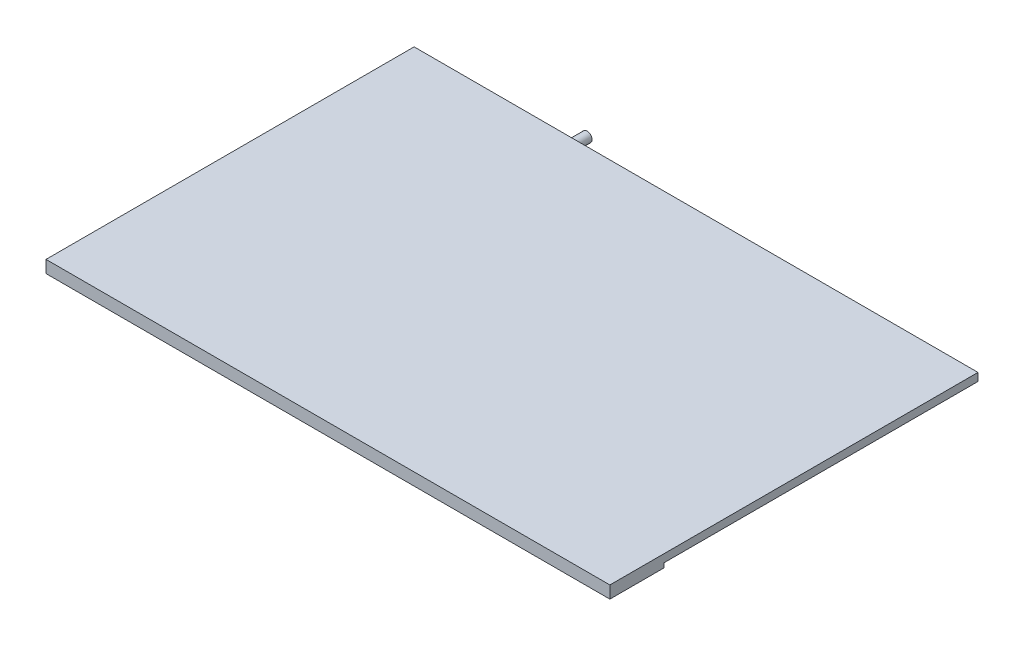
ISO-10303-21;
HEADER;
FILE_DESCRIPTION(('STEP AP214'),'2;1');
FILE_NAME('part.step','',(''),(''),'','','');
FILE_SCHEMA(('AUTOMOTIVE_DESIGN { 1 0 10303 214 1 1 1 1 }'));
ENDSEC;
DATA;
#1=APPLICATION_CONTEXT('core data for automotive mechanical design processes');
#2=APPLICATION_PROTOCOL_DEFINITION('international standard','automotive_design',2000,#1);
#3=PRODUCT_CONTEXT('',#1,'mechanical');
#4=PRODUCT('Part','Part','',(#3));
#5=PRODUCT_RELATED_PRODUCT_CATEGORY('part','',(#4));
#6=PRODUCT_DEFINITION_FORMATION('','',#4);
#7=PRODUCT_DEFINITION_CONTEXT('part definition',#1,'design');
#8=PRODUCT_DEFINITION('design','',#6,#7);
#9=PRODUCT_DEFINITION_SHAPE('','',#8);
#10=(LENGTH_UNIT() NAMED_UNIT(*) SI_UNIT(.MILLI.,.METRE.));
#11=(NAMED_UNIT(*) PLANE_ANGLE_UNIT() SI_UNIT($,.RADIAN.));
#12=(NAMED_UNIT(*) SI_UNIT($,.STERADIAN.) SOLID_ANGLE_UNIT());
#13=UNCERTAINTY_MEASURE_WITH_UNIT(LENGTH_MEASURE(1.E-05),#10,'distance_accuracy_value','');
#14=(GEOMETRIC_REPRESENTATION_CONTEXT(3) GLOBAL_UNCERTAINTY_ASSIGNED_CONTEXT((#13)) GLOBAL_UNIT_ASSIGNED_CONTEXT((#10,
#11,#12)) REPRESENTATION_CONTEXT('',''));
#15=CARTESIAN_POINT('',(0.,0.,0.));
#16=DIRECTION('',(0.,0.,1.));
#17=DIRECTION('',(1.,0.,0.));
#18=AXIS2_PLACEMENT_3D('',#15,#16,#17);
#19=CARTESIAN_POINT('',(0.,-4.8,-74.75));
#20=DIRECTION('',(0.,0.,-1.));
#21=DIRECTION('',(-1.,0.,0.));
#22=AXIS2_PLACEMENT_3D('',#19,#20,#21);
#23=PLANE('',#22);
#24=CARTESIAN_POINT('',(-54.25,-3.3,-74.75));
#25=DIRECTION('',(0.,0.,-1.));
#26=DIRECTION('',(-1.,0.,0.));
#27=AXIS2_PLACEMENT_3D('',#24,#25,#26);
#28=CIRCLE('',#27,2.);
#29=CARTESIAN_POINT('',(-52.9271243444677,-1.8,-74.75));
#30=VERTEX_POINT('',#29);
#31=CARTESIAN_POINT('',(-52.9271243444677,-4.8,-74.75));
#32=VERTEX_POINT('',#31);
#33=EDGE_CURVE('E11',#30,#32,#28,.T.);
#34=ORIENTED_EDGE('',*,*,#33,.F.);
#35=DIRECTION('',(-1.,0.,0.));
#36=VECTOR('',#35,1.);
#37=CARTESIAN_POINT('',(0.,-1.8,-74.75));
#38=LINE('',#37,#36);
#39=CARTESIAN_POINT('',(-48.75,-1.8,-74.75));
#40=VERTEX_POINT('',#39);
#41=EDGE_CURVE('E170',#40,#30,#38,.T.);
#42=ORIENTED_EDGE('',*,*,#41,.F.);
#43=DIRECTION('',(0.,1.,0.));
#44=VECTOR('',#43,1.);
#45=CARTESIAN_POINT('',(-48.75,-4.8,-74.75));
#46=LINE('',#45,#44);
#47=CARTESIAN_POINT('',(-48.75,-4.8,-74.75));
#48=VERTEX_POINT('',#47);
#49=EDGE_CURVE('E232',#48,#40,#46,.T.);
#50=ORIENTED_EDGE('',*,*,#49,.F.);
#51=DIRECTION('',(-1.,0.,0.));
#52=VECTOR('',#51,1.);
#53=CARTESIAN_POINT('',(0.,-4.8,-74.75));
#54=LINE('',#53,#52);
#55=EDGE_CURVE('E207',#48,#32,#54,.T.);
#56=ORIENTED_EDGE('',*,*,#55,.T.);
#57=EDGE_LOOP('',(#34,#42,#50,#56));
#58=FACE_BOUND('',#57,.T.);
#59=ADVANCED_FACE('F40',(#58),#23,.T.);
#60=CARTESIAN_POINT('',(0.,0.,0.));
#61=DIRECTION('',(0.,1.,0.));
#62=DIRECTION('',(0.,0.,1.));
#63=AXIS2_PLACEMENT_3D('',#60,#61,#62);
#64=PLANE('',#63);
#65=DIRECTION('',(1.,0.,0.));
#66=VECTOR('',#65,1.);
#67=CARTESIAN_POINT('',(0.,0.,52.75));
#68=LINE('',#67,#66);
#69=CARTESIAN_POINT('',(-114.5,0.,52.75));
#70=VERTEX_POINT('',#69);
#71=CARTESIAN_POINT('',(114.5,0.,52.75));
#72=VERTEX_POINT('',#71);
#73=EDGE_CURVE('E44',#70,#72,#68,.T.);
#74=ORIENTED_EDGE('',*,*,#73,.F.);
#75=DIRECTION('',(0.,0.,1.));
#76=VECTOR('',#75,1.);
#77=CARTESIAN_POINT('',(-114.5,0.,-74.75));
#78=LINE('',#77,#76);
#79=CARTESIAN_POINT('',(-114.5,0.,-74.75));
#80=VERTEX_POINT('',#79);
#81=EDGE_CURVE('E264',#80,#70,#78,.T.);
#82=ORIENTED_EDGE('',*,*,#81,.F.);
#83=DIRECTION('',(-1.,0.,0.));
#84=VECTOR('',#83,1.);
#85=CARTESIAN_POINT('',(-114.5,0.,-74.75));
#86=LINE('',#85,#84);
#87=CARTESIAN_POINT('',(114.5,0.,-74.75));
#88=VERTEX_POINT('',#87);
#89=EDGE_CURVE('E269',#88,#80,#86,.T.);
#90=ORIENTED_EDGE('',*,*,#89,.F.);
#91=DIRECTION('',(0.,0.,-1.));
#92=VECTOR('',#91,1.);
#93=CARTESIAN_POINT('',(114.5,0.,-74.75));
#94=LINE('',#93,#92);
#95=EDGE_CURVE('E278',#72,#88,#94,.T.);
#96=ORIENTED_EDGE('',*,*,#95,.F.);
#97=EDGE_LOOP('',(#74,#82,#90,#96));
#98=FACE_BOUND('',#97,.T.);
#99=ADVANCED_FACE('F306',(#98),#64,.F.);
#100=CARTESIAN_POINT('',(-114.5,3.2,-74.75));
#101=DIRECTION('',(1.,0.,0.));
#102=DIRECTION('',(0.,0.,-1.));
#103=AXIS2_PLACEMENT_3D('',#100,#101,#102);
#104=PLANE('',#103);
#105=DIRECTION('',(0.,-1.,0.));
#106=VECTOR('',#105,1.);
#107=CARTESIAN_POINT('',(-114.5,3.2,74.75));
#108=LINE('',#107,#106);
#109=CARTESIAN_POINT('',(-114.5,3.2,74.75));
#110=VERTEX_POINT('',#109);
#111=CARTESIAN_POINT('',(-114.5,-1.8,74.75));
#112=VERTEX_POINT('',#111);
#113=EDGE_CURVE('E287',#110,#112,#108,.T.);
#114=ORIENTED_EDGE('',*,*,#113,.F.);
#115=DIRECTION('',(0.,0.,1.));
#116=VECTOR('',#115,1.);
#117=CARTESIAN_POINT('',(-114.5,3.2,-74.75));
#118=LINE('',#117,#116);
#119=CARTESIAN_POINT('',(-114.5,3.2,-74.75));
#120=VERTEX_POINT('',#119);
#121=EDGE_CURVE('E266',#120,#110,#118,.T.);
#122=ORIENTED_EDGE('',*,*,#121,.F.);
#123=DIRECTION('',(0.,-1.,0.));
#124=VECTOR('',#123,1.);
#125=CARTESIAN_POINT('',(-114.5,3.2,-74.75));
#126=LINE('',#125,#124);
#127=EDGE_CURVE('E275',#120,#80,#126,.T.);
#128=ORIENTED_EDGE('',*,*,#127,.T.);
#129=ORIENTED_EDGE('',*,*,#81,.T.);
#130=DIRECTION('',(0.,1.,0.));
#131=VECTOR('',#130,1.);
#132=CARTESIAN_POINT('',(-114.5,-1.8,52.75));
#133=LINE('',#132,#131);
#134=CARTESIAN_POINT('',(-114.5,-1.8,52.75));
#135=VERTEX_POINT('',#134);
#136=EDGE_CURVE('E260',#135,#70,#133,.T.);
#137=ORIENTED_EDGE('',*,*,#136,.F.);
#138=DIRECTION('',(0.,0.,1.));
#139=VECTOR('',#138,1.);
#140=CARTESIAN_POINT('',(-114.5,-1.8,0.));
#141=LINE('',#140,#139);
#142=EDGE_CURVE('E250',#135,#112,#141,.T.);
#143=ORIENTED_EDGE('',*,*,#142,.T.);
#144=EDGE_LOOP('',(#114,#122,#128,#129,#137,#143));
#145=FACE_BOUND('',#144,.T.);
#146=ADVANCED_FACE('F42',(#145),#104,.F.);
#147=CARTESIAN_POINT('',(-114.5,3.2,74.75));
#148=DIRECTION('',(0.,0.,-1.));
#149=DIRECTION('',(-1.,0.,0.));
#150=AXIS2_PLACEMENT_3D('',#147,#148,#149);
#151=PLANE('',#150);
#152=ORIENTED_EDGE('',*,*,#113,.T.);
#153=DIRECTION('',(1.,0.,0.));
#154=VECTOR('',#153,1.);
#155=CARTESIAN_POINT('',(0.,-1.8,74.75));
#156=LINE('',#155,#154);
#157=CARTESIAN_POINT('',(114.5,-1.8,74.75));
#158=VERTEX_POINT('',#157);
#159=EDGE_CURVE('E254',#112,#158,#156,.T.);
#160=ORIENTED_EDGE('',*,*,#159,.T.);
#161=DIRECTION('',(0.,-1.,0.));
#162=VECTOR('',#161,1.);
#163=CARTESIAN_POINT('',(114.5,3.2,74.75));
#164=LINE('',#163,#162);
#165=CARTESIAN_POINT('',(114.5,3.2,74.75));
#166=VERTEX_POINT('',#165);
#167=EDGE_CURVE('E286',#166,#158,#164,.T.);
#168=ORIENTED_EDGE('',*,*,#167,.F.);
#169=DIRECTION('',(1.,0.,0.));
#170=VECTOR('',#169,1.);
#171=CARTESIAN_POINT('',(-114.5,3.2,74.75));
#172=LINE('',#171,#170);
#173=EDGE_CURVE('E268',#110,#166,#172,.T.);
#174=ORIENTED_EDGE('',*,*,#173,.F.);
#175=EDGE_LOOP('',(#152,#160,#168,#174));
#176=FACE_BOUND('',#175,.T.);
#177=ADVANCED_FACE('F316',(#176),#151,.F.);
#178=CARTESIAN_POINT('',(114.5,3.2,-74.75));
#179=DIRECTION('',(-1.,0.,0.));
#180=DIRECTION('',(0.,0.,1.));
#181=AXIS2_PLACEMENT_3D('',#178,#179,#180);
#182=PLANE('',#181);
#183=ORIENTED_EDGE('',*,*,#167,.T.);
#184=DIRECTION('',(0.,0.,-1.));
#185=VECTOR('',#184,1.);
#186=CARTESIAN_POINT('',(114.5,-1.8,0.));
#187=LINE('',#186,#185);
#188=CARTESIAN_POINT('',(114.5,-1.8,52.75));
#189=VERTEX_POINT('',#188);
#190=EDGE_CURVE('E257',#158,#189,#187,.T.);
#191=ORIENTED_EDGE('',*,*,#190,.T.);
#192=DIRECTION('',(0.,1.,0.));
#193=VECTOR('',#192,1.);
#194=CARTESIAN_POINT('',(114.5,-1.8,52.75));
#195=LINE('',#194,#193);
#196=EDGE_CURVE('E261',#189,#72,#195,.T.);
#197=ORIENTED_EDGE('',*,*,#196,.T.);
#198=ORIENTED_EDGE('',*,*,#95,.T.);
#199=DIRECTION('',(0.,-1.,0.));
#200=VECTOR('',#199,1.);
#201=CARTESIAN_POINT('',(114.5,3.2,-74.75));
#202=LINE('',#201,#200);
#203=CARTESIAN_POINT('',(114.5,3.2,-74.75));
#204=VERTEX_POINT('',#203);
#205=EDGE_CURVE('E283',#204,#88,#202,.T.);
#206=ORIENTED_EDGE('',*,*,#205,.F.);
#207=DIRECTION('',(0.,0.,-1.));
#208=VECTOR('',#207,1.);
#209=CARTESIAN_POINT('',(114.5,3.2,-74.75));
#210=LINE('',#209,#208);
#211=EDGE_CURVE('E271',#166,#204,#210,.T.);
#212=ORIENTED_EDGE('',*,*,#211,.F.);
#213=EDGE_LOOP('',(#183,#191,#197,#198,#206,#212));
#214=FACE_BOUND('',#213,.T.);
#215=ADVANCED_FACE('F302',(#214),#182,.F.);
#216=CARTESIAN_POINT('',(-114.5,3.2,-74.75));
#217=DIRECTION('',(0.,0.,1.));
#218=DIRECTION('',(1.,0.,0.));
#219=AXIS2_PLACEMENT_3D('',#216,#217,#218);
#220=PLANE('',#219);
#221=ORIENTED_EDGE('',*,*,#89,.T.);
#222=ORIENTED_EDGE('',*,*,#127,.F.);
#223=DIRECTION('',(-1.,0.,0.));
#224=VECTOR('',#223,1.);
#225=CARTESIAN_POINT('',(-114.5,3.2,-74.75));
#226=LINE('',#225,#224);
#227=EDGE_CURVE('E273',#204,#120,#226,.T.);
#228=ORIENTED_EDGE('',*,*,#227,.F.);
#229=ORIENTED_EDGE('',*,*,#205,.T.);
#230=EDGE_LOOP('',(#221,#222,#228,#229));
#231=FACE_BOUND('',#230,.T.);
#232=ADVANCED_FACE('F309',(#231),#220,.F.);
#233=CARTESIAN_POINT('',(0.,3.2,0.));
#234=DIRECTION('',(0.,1.,0.));
#235=DIRECTION('',(0.,0.,1.));
#236=AXIS2_PLACEMENT_3D('',#233,#234,#235);
#237=PLANE('',#236);
#238=ORIENTED_EDGE('',*,*,#211,.T.);
#239=ORIENTED_EDGE('',*,*,#227,.T.);
#240=ORIENTED_EDGE('',*,*,#121,.T.);
#241=ORIENTED_EDGE('',*,*,#173,.T.);
#242=EDGE_LOOP('',(#238,#239,#240,#241));
#243=FACE_BOUND('',#242,.T.);
#244=ADVANCED_FACE('F314',(#243),#237,.T.);
#245=CARTESIAN_POINT('',(0.,-1.8,52.75));
#246=DIRECTION('',(0.,0.,1.));
#247=DIRECTION('',(1.,0.,0.));
#248=AXIS2_PLACEMENT_3D('',#245,#246,#247);
#249=PLANE('',#248);
#250=ORIENTED_EDGE('',*,*,#136,.T.);
#251=ORIENTED_EDGE('',*,*,#73,.T.);
#252=ORIENTED_EDGE('',*,*,#196,.F.);
#253=DIRECTION('',(1.,0.,0.));
#254=VECTOR('',#253,1.);
#255=CARTESIAN_POINT('',(0.,-1.8,52.75));
#256=LINE('',#255,#254);
#257=CARTESIAN_POINT('',(-41.,-1.8,52.75));
#258=VERTEX_POINT('',#257);
#259=EDGE_CURVE('E246',#258,#189,#256,.T.);
#260=ORIENTED_EDGE('',*,*,#259,.F.);
#261=CARTESIAN_POINT('',(-67.5,-1.8,52.75));
#262=VERTEX_POINT('',#261);
#263=EDGE_CURVE('E251',#262,#258,#256,.T.);
#264=ORIENTED_EDGE('',*,*,#263,.F.);
#265=EDGE_CURVE('E247',#135,#262,#256,.T.);
#266=ORIENTED_EDGE('',*,*,#265,.F.);
#267=EDGE_LOOP('',(#250,#251,#252,#260,#264,#266));
#268=FACE_BOUND('',#267,.T.);
#269=ADVANCED_FACE('F295',(#268),#249,.F.);
#270=CARTESIAN_POINT('',(0.,-1.8,0.));
#271=DIRECTION('',(0.,1.,0.));
#272=DIRECTION('',(0.,0.,1.));
#273=AXIS2_PLACEMENT_3D('',#270,#271,#272);
#274=PLANE('',#273);
#275=DIRECTION('',(1.,0.,0.));
#276=VECTOR('',#275,1.);
#277=CARTESIAN_POINT('',(0.,-1.8,61.55));
#278=LINE('',#277,#276);
#279=CARTESIAN_POINT('',(-67.5,-1.8,61.55));
#280=VERTEX_POINT('',#279);
#281=CARTESIAN_POINT('',(-41.,-1.8,61.55));
#282=VERTEX_POINT('',#281);
#283=EDGE_CURVE('E215',#280,#282,#278,.T.);
#284=ORIENTED_EDGE('',*,*,#283,.T.);
#285=DIRECTION('',(0.,0.,-1.));
#286=VECTOR('',#285,1.);
#287=CARTESIAN_POINT('',(-41.,-1.8,0.));
#288=LINE('',#287,#286);
#289=EDGE_CURVE('E212',#282,#258,#288,.T.);
#290=ORIENTED_EDGE('',*,*,#289,.T.);
#291=ORIENTED_EDGE('',*,*,#259,.T.);
#292=ORIENTED_EDGE('',*,*,#190,.F.);
#293=ORIENTED_EDGE('',*,*,#159,.F.);
#294=ORIENTED_EDGE('',*,*,#142,.F.);
#295=ORIENTED_EDGE('',*,*,#265,.T.);
#296=DIRECTION('',(0.,0.,-1.));
#297=VECTOR('',#296,1.);
#298=CARTESIAN_POINT('',(-67.5,-1.8,0.));
#299=LINE('',#298,#297);
#300=EDGE_CURVE('E219',#280,#262,#299,.T.);
#301=ORIENTED_EDGE('',*,*,#300,.F.);
#302=EDGE_LOOP('',(#284,#290,#291,#292,#293,#294,#295,#301));
#303=FACE_BOUND('',#302,.T.);
#304=ADVANCED_FACE('F320',(#303),#274,.F.);
#305=CARTESIAN_POINT('',(0.,-1.8,0.));
#306=DIRECTION('',(0.,-1.,0.));
#307=DIRECTION('',(0.,0.,-1.));
#308=AXIS2_PLACEMENT_3D('',#305,#306,#307);
#309=PLANE('',#308);
#310=CARTESIAN_POINT('',(-67.5,-1.8,39.55));
#311=VERTEX_POINT('',#310);
#312=EDGE_CURVE('E218',#262,#311,#299,.T.);
#313=ORIENTED_EDGE('',*,*,#312,.F.);
#314=ORIENTED_EDGE('',*,*,#263,.T.);
#315=CARTESIAN_POINT('',(-41.,-1.8,39.55));
#316=VERTEX_POINT('',#315);
#317=EDGE_CURVE('E188',#258,#316,#288,.T.);
#318=ORIENTED_EDGE('',*,*,#317,.T.);
#319=DIRECTION('',(1.,0.,0.));
#320=VECTOR('',#319,1.);
#321=CARTESIAN_POINT('',(0.,-1.8,39.55));
#322=LINE('',#321,#320);
#323=CARTESIAN_POINT('',(-48.75,-1.8,39.55));
#324=VERTEX_POINT('',#323);
#325=EDGE_CURVE('E195',#324,#316,#322,.T.);
#326=ORIENTED_EDGE('',*,*,#325,.F.);
#327=DIRECTION('',(0.,0.,-1.));
#328=VECTOR('',#327,1.);
#329=CARTESIAN_POINT('',(-48.75,-1.8,0.));
#330=LINE('',#329,#328);
#331=EDGE_CURVE('E225',#324,#40,#330,.T.);
#332=ORIENTED_EDGE('',*,*,#331,.T.);
#333=ORIENTED_EDGE('',*,*,#41,.T.);
#334=CARTESIAN_POINT('',(-55.5728756555323,-1.8,-74.75));
#335=VERTEX_POINT('',#334);
#336=EDGE_CURVE('E163',#30,#335,#38,.T.);
#337=ORIENTED_EDGE('',*,*,#336,.T.);
#338=CARTESIAN_POINT('',(-59.75,-1.8,-74.75));
#339=VERTEX_POINT('',#338);
#340=EDGE_CURVE('E166',#335,#339,#38,.T.);
#341=ORIENTED_EDGE('',*,*,#340,.T.);
#342=DIRECTION('',(0.,0.,-1.));
#343=VECTOR('',#342,1.);
#344=CARTESIAN_POINT('',(-59.75,-1.8,0.));
#345=LINE('',#344,#343);
#346=CARTESIAN_POINT('',(-59.75,-1.8,39.55));
#347=VERTEX_POINT('',#346);
#348=EDGE_CURVE('E179',#347,#339,#345,.T.);
#349=ORIENTED_EDGE('',*,*,#348,.F.);
#350=EDGE_CURVE('E222',#311,#347,#322,.T.);
#351=ORIENTED_EDGE('',*,*,#350,.F.);
#352=EDGE_LOOP('',(#313,#314,#318,#326,#332,#333,#337,#341,#349,#351));
#353=FACE_BOUND('',#352,.T.);
#354=ADVANCED_FACE('F164',(#353),#309,.F.);
#355=CARTESIAN_POINT('',(-41.,-4.8,0.));
#356=DIRECTION('',(1.,0.,0.));
#357=DIRECTION('',(0.,0.,-1.));
#358=AXIS2_PLACEMENT_3D('',#355,#356,#357);
#359=PLANE('',#358);
#360=ORIENTED_EDGE('',*,*,#289,.F.);
#361=DIRECTION('',(0.,1.,0.));
#362=VECTOR('',#361,1.);
#363=CARTESIAN_POINT('',(-41.,-4.8,61.55));
#364=LINE('',#363,#362);
#365=CARTESIAN_POINT('',(-41.,-4.8,61.55));
#366=VERTEX_POINT('',#365);
#367=EDGE_CURVE('E243',#366,#282,#364,.T.);
#368=ORIENTED_EDGE('',*,*,#367,.F.);
#369=DIRECTION('',(0.,0.,-1.));
#370=VECTOR('',#369,1.);
#371=CARTESIAN_POINT('',(-41.,-4.8,0.));
#372=LINE('',#371,#370);
#373=CARTESIAN_POINT('',(-41.,-4.8,39.55));
#374=VERTEX_POINT('',#373);
#375=EDGE_CURVE('E191',#366,#374,#372,.T.);
#376=ORIENTED_EDGE('',*,*,#375,.T.);
#377=DIRECTION('',(0.,1.,0.));
#378=VECTOR('',#377,1.);
#379=CARTESIAN_POINT('',(-41.,-4.8,39.55));
#380=LINE('',#379,#378);
#381=EDGE_CURVE('E227',#374,#316,#380,.T.);
#382=ORIENTED_EDGE('',*,*,#381,.T.);
#383=ORIENTED_EDGE('',*,*,#317,.F.);
#384=EDGE_LOOP('',(#360,#368,#376,#382,#383));
#385=FACE_BOUND('',#384,.T.);
#386=ADVANCED_FACE('F326',(#385),#359,.T.);
#387=CARTESIAN_POINT('',(0.,-4.8,61.55));
#388=DIRECTION('',(0.,0.,1.));
#389=DIRECTION('',(1.,0.,0.));
#390=AXIS2_PLACEMENT_3D('',#387,#388,#389);
#391=PLANE('',#390);
#392=ORIENTED_EDGE('',*,*,#283,.F.);
#393=DIRECTION('',(0.,1.,0.));
#394=VECTOR('',#393,1.);
#395=CARTESIAN_POINT('',(-67.5,-4.8,61.55));
#396=LINE('',#395,#394);
#397=CARTESIAN_POINT('',(-67.5,-4.8,61.55));
#398=VERTEX_POINT('',#397);
#399=EDGE_CURVE('E241',#398,#280,#396,.T.);
#400=ORIENTED_EDGE('',*,*,#399,.F.);
#401=DIRECTION('',(1.,0.,0.));
#402=VECTOR('',#401,1.);
#403=CARTESIAN_POINT('',(0.,-4.8,61.55));
#404=LINE('',#403,#402);
#405=EDGE_CURVE('E194',#398,#366,#404,.T.);
#406=ORIENTED_EDGE('',*,*,#405,.T.);
#407=ORIENTED_EDGE('',*,*,#367,.T.);
#408=EDGE_LOOP('',(#392,#400,#406,#407));
#409=FACE_BOUND('',#408,.T.);
#410=ADVANCED_FACE('F356',(#409),#391,.T.);
#411=CARTESIAN_POINT('',(-67.5,-4.8,0.));
#412=DIRECTION('',(1.,0.,0.));
#413=DIRECTION('',(0.,0.,-1.));
#414=AXIS2_PLACEMENT_3D('',#411,#412,#413);
#415=PLANE('',#414);
#416=ORIENTED_EDGE('',*,*,#300,.T.);
#417=ORIENTED_EDGE('',*,*,#312,.T.);
#418=DIRECTION('',(0.,1.,0.));
#419=VECTOR('',#418,1.);
#420=CARTESIAN_POINT('',(-67.5,-4.8,39.55));
#421=LINE('',#420,#419);
#422=CARTESIAN_POINT('',(-67.5,-4.8,39.55));
#423=VERTEX_POINT('',#422);
#424=EDGE_CURVE('E238',#423,#311,#421,.T.);
#425=ORIENTED_EDGE('',*,*,#424,.F.);
#426=DIRECTION('',(0.,0.,-1.));
#427=VECTOR('',#426,1.);
#428=CARTESIAN_POINT('',(-67.5,-4.8,0.));
#429=LINE('',#428,#427);
#430=EDGE_CURVE('E198',#398,#423,#429,.T.);
#431=ORIENTED_EDGE('',*,*,#430,.F.);
#432=ORIENTED_EDGE('',*,*,#399,.T.);
#433=EDGE_LOOP('',(#416,#417,#425,#431,#432));
#434=FACE_BOUND('',#433,.T.);
#435=ADVANCED_FACE('F351',(#434),#415,.F.);
#436=CARTESIAN_POINT('',(0.,-4.8,39.55));
#437=DIRECTION('',(0.,0.,1.));
#438=DIRECTION('',(1.,0.,0.));
#439=AXIS2_PLACEMENT_3D('',#436,#437,#438);
#440=PLANE('',#439);
#441=ORIENTED_EDGE('',*,*,#350,.T.);
#442=DIRECTION('',(0.,1.,0.));
#443=VECTOR('',#442,1.);
#444=CARTESIAN_POINT('',(-59.75,-4.8,39.55));
#445=LINE('',#444,#443);
#446=CARTESIAN_POINT('',(-59.75,-4.8,39.55));
#447=VERTEX_POINT('',#446);
#448=EDGE_CURVE('E235',#447,#347,#445,.T.);
#449=ORIENTED_EDGE('',*,*,#448,.F.);
#450=DIRECTION('',(1.,0.,0.));
#451=VECTOR('',#450,1.);
#452=CARTESIAN_POINT('',(0.,-4.8,39.55));
#453=LINE('',#452,#451);
#454=EDGE_CURVE('E200',#423,#447,#453,.T.);
#455=ORIENTED_EDGE('',*,*,#454,.F.);
#456=ORIENTED_EDGE('',*,*,#424,.T.);
#457=EDGE_LOOP('',(#441,#449,#455,#456));
#458=FACE_BOUND('',#457,.T.);
#459=ADVANCED_FACE('F347',(#458),#440,.F.);
#460=CARTESIAN_POINT('',(-59.75,-4.8,0.));
#461=DIRECTION('',(1.,0.,0.));
#462=DIRECTION('',(0.,0.,-1.));
#463=AXIS2_PLACEMENT_3D('',#460,#461,#462);
#464=PLANE('',#463);
#465=ORIENTED_EDGE('',*,*,#348,.T.);
#466=DIRECTION('',(0.,1.,0.));
#467=VECTOR('',#466,1.);
#468=CARTESIAN_POINT('',(-59.75,-4.8,-74.75));
#469=LINE('',#468,#467);
#470=CARTESIAN_POINT('',(-59.75,-4.8,-74.75));
#471=VERTEX_POINT('',#470);
#472=EDGE_CURVE('E177',#471,#339,#469,.T.);
#473=ORIENTED_EDGE('',*,*,#472,.F.);
#474=DIRECTION('',(0.,0.,-1.));
#475=VECTOR('',#474,1.);
#476=CARTESIAN_POINT('',(-59.75,-4.8,0.));
#477=LINE('',#476,#475);
#478=EDGE_CURVE('E202',#447,#471,#477,.T.);
#479=ORIENTED_EDGE('',*,*,#478,.F.);
#480=ORIENTED_EDGE('',*,*,#448,.T.);
#481=EDGE_LOOP('',(#465,#473,#479,#480));
#482=FACE_BOUND('',#481,.T.);
#483=ADVANCED_FACE('F345',(#482),#464,.F.);
#484=CARTESIAN_POINT('',(-55.5728756555323,-4.8,-74.75));
#485=VERTEX_POINT('',#484);
#486=EDGE_CURVE('E49',#485,#335,#28,.T.);
#487=ORIENTED_EDGE('',*,*,#486,.F.);
#488=EDGE_CURVE('E206',#485,#471,#54,.T.);
#489=ORIENTED_EDGE('',*,*,#488,.T.);
#490=ORIENTED_EDGE('',*,*,#472,.T.);
#491=ORIENTED_EDGE('',*,*,#340,.F.);
#492=EDGE_LOOP('',(#487,#489,#490,#491));
#493=FACE_BOUND('',#492,.T.);
#494=ADVANCED_FACE('F175',(#493),#23,.T.);
#495=CARTESIAN_POINT('',(-48.75,-4.8,0.));
#496=DIRECTION('',(1.,0.,0.));
#497=DIRECTION('',(0.,0.,-1.));
#498=AXIS2_PLACEMENT_3D('',#495,#496,#497);
#499=PLANE('',#498);
#500=ORIENTED_EDGE('',*,*,#331,.F.);
#501=DIRECTION('',(0.,1.,0.));
#502=VECTOR('',#501,1.);
#503=CARTESIAN_POINT('',(-48.75,-4.8,39.55));
#504=LINE('',#503,#502);
#505=CARTESIAN_POINT('',(-48.75,-4.8,39.55));
#506=VERTEX_POINT('',#505);
#507=EDGE_CURVE('E230',#506,#324,#504,.T.);
#508=ORIENTED_EDGE('',*,*,#507,.F.);
#509=DIRECTION('',(0.,0.,-1.));
#510=VECTOR('',#509,1.);
#511=CARTESIAN_POINT('',(-48.75,-4.8,0.));
#512=LINE('',#511,#510);
#513=EDGE_CURVE('E209',#506,#48,#512,.T.);
#514=ORIENTED_EDGE('',*,*,#513,.T.);
#515=ORIENTED_EDGE('',*,*,#49,.T.);
#516=EDGE_LOOP('',(#500,#508,#514,#515));
#517=FACE_BOUND('',#516,.T.);
#518=ADVANCED_FACE('F335',(#517),#499,.T.);
#519=ORIENTED_EDGE('',*,*,#325,.T.);
#520=ORIENTED_EDGE('',*,*,#381,.F.);
#521=EDGE_CURVE('E203',#506,#374,#453,.T.);
#522=ORIENTED_EDGE('',*,*,#521,.F.);
#523=ORIENTED_EDGE('',*,*,#507,.T.);
#524=EDGE_LOOP('',(#519,#520,#522,#523));
#525=FACE_BOUND('',#524,.T.);
#526=ADVANCED_FACE('F332',(#525),#440,.F.);
#527=CARTESIAN_POINT('',(0.,-4.8,0.));
#528=DIRECTION('',(0.,-1.,0.));
#529=DIRECTION('',(0.,0.,-1.));
#530=AXIS2_PLACEMENT_3D('',#527,#528,#529);
#531=PLANE('',#530);
#532=ORIENTED_EDGE('',*,*,#375,.F.);
#533=ORIENTED_EDGE('',*,*,#405,.F.);
#534=ORIENTED_EDGE('',*,*,#430,.T.);
#535=ORIENTED_EDGE('',*,*,#454,.T.);
#536=ORIENTED_EDGE('',*,*,#478,.T.);
#537=ORIENTED_EDGE('',*,*,#488,.F.);
#538=EDGE_CURVE('E64',#32,#485,#54,.T.);
#539=ORIENTED_EDGE('',*,*,#538,.F.);
#540=ORIENTED_EDGE('',*,*,#55,.F.);
#541=ORIENTED_EDGE('',*,*,#513,.F.);
#542=ORIENTED_EDGE('',*,*,#521,.T.);
#543=EDGE_LOOP('',(#532,#533,#534,#535,#536,#537,#539,#540,#541,#542));
#544=FACE_BOUND('',#543,.T.);
#545=ADVANCED_FACE('F341',(#544),#531,.T.);
#546=CARTESIAN_POINT('',(-54.25,-3.3,-74.75));
#547=DIRECTION('',(0.,0.,-1.));
#548=DIRECTION('',(-1.,0.,0.));
#549=AXIS2_PLACEMENT_3D('',#546,#547,#548);
#550=PLANE('',#549);
#551=EDGE_CURVE('E51',#32,#485,#28,.T.);
#552=ORIENTED_EDGE('',*,*,#551,.F.);
#553=ORIENTED_EDGE('',*,*,#538,.T.);
#554=EDGE_LOOP('',(#552,#553));
#555=FACE_BOUND('',#554,.T.);
#556=ADVANCED_FACE('F339',(#555),#550,.F.);
#557=CARTESIAN_POINT('',(-54.25,-3.3,-84.75));
#558=DIRECTION('',(0.,0.,1.));
#559=DIRECTION('',(1.,0.,0.));
#560=AXIS2_PLACEMENT_3D('',#557,#558,#559);
#561=CYLINDRICAL_SURFACE('',#560,2.);
#562=CARTESIAN_POINT('',(-54.25,-3.3,-84.75));
#563=DIRECTION('',(0.,0.,-1.));
#564=DIRECTION('',(-1.,0.,0.));
#565=AXIS2_PLACEMENT_3D('',#562,#563,#564);
#566=CIRCLE('',#565,2.);
#567=CARTESIAN_POINT('',(-56.25,-3.3,-84.75));
#568=VERTEX_POINT('',#567);
#569=EDGE_CURVE('E186',#568,#568,#566,.T.);
#570=ORIENTED_EDGE('',*,*,#569,.F.);
#571=EDGE_LOOP('',(#570));
#572=FACE_BOUND('',#571,.T.);
#573=EDGE_CURVE('E183',#335,#30,#28,.T.);
#574=ORIENTED_EDGE('',*,*,#573,.T.);
#575=ORIENTED_EDGE('',*,*,#33,.T.);
#576=ORIENTED_EDGE('',*,*,#551,.T.);
#577=ORIENTED_EDGE('',*,*,#486,.T.);
#578=EDGE_LOOP('',(#574,#575,#576,#577));
#579=FACE_BOUND('',#578,.T.);
#580=ADVANCED_FACE('F182',(#572,#579),#561,.T.);
#581=CARTESIAN_POINT('',(-54.25,-3.3,-84.75));
#582=DIRECTION('',(0.,0.,-1.));
#583=DIRECTION('',(-1.,0.,0.));
#584=AXIS2_PLACEMENT_3D('',#581,#582,#583);
#585=PLANE('',#584);
#586=ORIENTED_EDGE('',*,*,#569,.T.);
#587=EDGE_LOOP('',(#586));
#588=FACE_BOUND('',#587,.T.);
#589=ADVANCED_FACE('F516',(#588),#585,.T.);
#590=ORIENTED_EDGE('',*,*,#336,.F.);
#591=ORIENTED_EDGE('',*,*,#573,.F.);
#592=EDGE_LOOP('',(#590,#591));
#593=FACE_BOUND('',#592,.T.);
#594=ADVANCED_FACE('F185',(#593),#550,.F.);
#595=CLOSED_SHELL('',(#59,#99,#146,#177,#215,#232,#244,#269,#304,#354,#386,#410,#435,#459,#483,
#494,#518,#526,#545,#556,#580,#589,#594));
#596=MANIFOLD_SOLID_BREP('B2',#595);
#597=ADVANCED_BREP_SHAPE_REPRESENTATION('',(#18,#596),#14);
#598=SHAPE_DEFINITION_REPRESENTATION(#9,#597);
ENDSEC;
END-ISO-10303-21;
